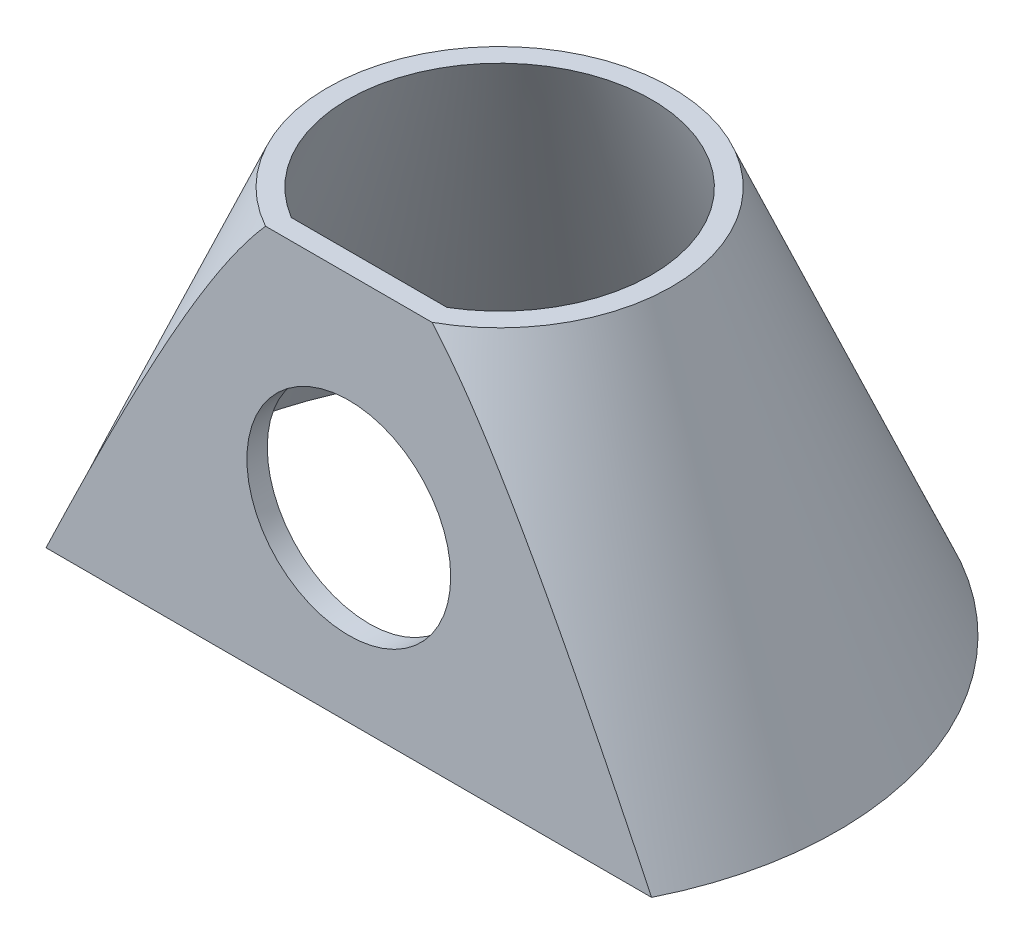
ISO-10303-21;
HEADER;
FILE_DESCRIPTION(('STEP AP214'),'2;1');
FILE_NAME('part.step','',(''),(''),'','','');
FILE_SCHEMA(('AUTOMOTIVE_DESIGN { 1 0 10303 214 1 1 1 1 }'));
ENDSEC;
DATA;
#1=APPLICATION_CONTEXT('core data for automotive mechanical design processes');
#2=APPLICATION_PROTOCOL_DEFINITION('international standard','automotive_design',2000,#1);
#3=PRODUCT_CONTEXT('',#1,'mechanical');
#4=PRODUCT('Part','Part','',(#3));
#5=PRODUCT_RELATED_PRODUCT_CATEGORY('part','',(#4));
#6=PRODUCT_DEFINITION_FORMATION('','',#4);
#7=PRODUCT_DEFINITION_CONTEXT('part definition',#1,'design');
#8=PRODUCT_DEFINITION('design','',#6,#7);
#9=PRODUCT_DEFINITION_SHAPE('','',#8);
#10=(LENGTH_UNIT() NAMED_UNIT(*) SI_UNIT(.MILLI.,.METRE.));
#11=(NAMED_UNIT(*) PLANE_ANGLE_UNIT() SI_UNIT($,.RADIAN.));
#12=(NAMED_UNIT(*) SI_UNIT($,.STERADIAN.) SOLID_ANGLE_UNIT());
#13=UNCERTAINTY_MEASURE_WITH_UNIT(LENGTH_MEASURE(1.E-05),#10,'distance_accuracy_value','');
#14=(GEOMETRIC_REPRESENTATION_CONTEXT(3) GLOBAL_UNCERTAINTY_ASSIGNED_CONTEXT((#13)) GLOBAL_UNIT_ASSIGNED_CONTEXT((#10,
#11,#12)) REPRESENTATION_CONTEXT('',''));
#15=CARTESIAN_POINT('',(0.,0.,0.));
#16=DIRECTION('',(0.,0.,1.));
#17=DIRECTION('',(1.,0.,0.));
#18=AXIS2_PLACEMENT_3D('',#15,#16,#17);
#19=CARTESIAN_POINT('',(-21.6651654977236,-2.68328734594304,7.4));
#20=DIRECTION('',(0.,0.,-1.));
#21=DIRECTION('',(-1.,0.,0.));
#22=AXIS2_PLACEMENT_3D('',#19,#20,#21);
#23=PLANE('',#22);
#24=CARTESIAN_POINT('',(0.,7.01671265405697,7.4));
#25=DIRECTION('',(0.,0.,1.));
#26=DIRECTION('',(1.,0.,0.));
#27=AXIS2_PLACEMENT_3D('',#24,#25,#26);
#28=CIRCLE('',#27,5.);
#29=CARTESIAN_POINT('',(5.,7.01671265405697,7.4));
#30=VERTEX_POINT('',#29);
#31=EDGE_CURVE('E81',#30,#30,#28,.T.);
#32=ORIENTED_EDGE('',*,*,#31,.F.);
#33=EDGE_LOOP('',(#32));
#34=FACE_BOUND('',#33,.T.);
#35=CARTESIAN_POINT('',(-25.5153695014383,-25.000462947489,7.4));
#36=CARTESIAN_POINT('',(-25.1987811037342,-24.2893071531394,7.4));
#37=CARTESIAN_POINT('',(-24.8818148083435,-23.5783196268933,7.4));
#38=CARTESIAN_POINT('',(-24.2470273094439,-22.1567257916633,7.4));
#39=CARTESIAN_POINT('',(-23.929206105383,-21.446119482926,7.4));
#40=CARTESIAN_POINT('',(-22.9742887787246,-19.3148887886707,7.4));
#41=CARTESIAN_POINT('',(-22.3357620983142,-17.8949046912977,7.4));
#42=CARTESIAN_POINT('',(-21.0528616653301,-15.0550035630363,7.4));
#43=CARTESIAN_POINT('',(-20.4084805544433,-13.6350898546372,7.4));
#44=CARTESIAN_POINT('',(-19.1133242946361,-10.7982249529963,7.4));
#45=CARTESIAN_POINT('',(-18.4625493274255,-9.38127367694376,7.4));
#46=CARTESIAN_POINT('',(-17.4666150236184,-7.2302541840945,7.4));
#47=CARTESIAN_POINT('',(-17.1246278702415,-6.49471725146057,7.4));
#48=CARTESIAN_POINT('',(-16.4378440024824,-5.02495626130916,7.4));
#49=CARTESIAN_POINT('',(-16.0930472910668,-4.29073220240642,7.4));
#50=CARTESIAN_POINT('',(-15.4000540673009,-2.82380660208974,7.4));
#51=CARTESIAN_POINT('',(-15.0518572455827,-2.09110520671575,7.4));
#52=CARTESIAN_POINT('',(-14.3513670311147,-0.627665151721085,7.4));
#53=CARTESIAN_POINT('',(-13.9990736551598,0.103073515931128,7.4));
#54=CARTESIAN_POINT('',(-13.2896866855573,1.56156015933721,7.4));
#55=CARTESIAN_POINT('',(-12.9325967899877,2.28930993112212,7.4));
#56=CARTESIAN_POINT('',(-12.2120648568836,3.7416539887777,7.4));
#57=CARTESIAN_POINT('',(-11.8486228755754,4.46624830250847,7.4));
#58=CARTESIAN_POINT('',(-11.1136355886296,5.91119902042788,7.4));
#59=CARTESIAN_POINT('',(-10.7420914707322,6.63155602638915,7.4));
#60=CARTESIAN_POINT('',(-10.1766795809354,7.70782143855152,7.4));
#61=CARTESIAN_POINT('',(-9.98686300524666,8.06585876194232,7.4));
#62=CARTESIAN_POINT('',(-9.60407031130492,8.78023917701544,7.4));
#63=CARTESIAN_POINT('',(-9.4110942225603,9.13658228448092,7.4));
#64=CARTESIAN_POINT('',(-9.07200380756849,9.75499765640086,7.4));
#65=CARTESIAN_POINT('',(-8.92672816132625,10.0175297408098,7.4));
#66=CARTESIAN_POINT('',(-8.63386131671555,10.5413037248503,7.4));
#67=CARTESIAN_POINT('',(-8.48627009726228,10.8025456127053,7.4));
#68=CARTESIAN_POINT('',(-8.18841403061081,11.3235709855227,7.4));
#69=CARTESIAN_POINT('',(-8.03814865994441,11.5833541715537,7.4));
#70=CARTESIAN_POINT('',(-7.7345722040517,12.101135226453,7.4));
#71=CARTESIAN_POINT('',(-7.58126113727745,12.3591331061247,7.4));
#72=CARTESIAN_POINT('',(-7.27203017464863,12.8714560315719,7.4));
#73=CARTESIAN_POINT('',(-7.11613143015534,13.1257938237222,7.4));
#74=CARTESIAN_POINT('',(-6.8002410854048,13.6319135263038,7.4));
#75=CARTESIAN_POINT('',(-6.64024956738023,13.8836954879454,7.4));
#76=CARTESIAN_POINT('',(-6.31546091276421,14.3840499155108,7.4));
#77=CARTESIAN_POINT('',(-6.15066509759186,14.6326232373306,7.4));
#78=CARTESIAN_POINT('',(-5.81527740997833,15.1258202700154,7.4));
#79=CARTESIAN_POINT('',(-5.6446859718727,15.370444274832,7.4));
#80=CARTESIAN_POINT('',(-5.35211707780906,15.7772190972783,7.4));
#81=CARTESIAN_POINT('',(-5.23203494578663,15.9407323419574,7.4));
#82=CARTESIAN_POINT('',(-4.98809754968169,16.2649348846004,7.4));
#83=CARTESIAN_POINT('',(-4.864242178147,16.4256241019374,7.4));
#84=CARTESIAN_POINT('',(-4.61135157562501,16.7445722481355,7.4));
#85=CARTESIAN_POINT('',(-4.48228817654204,16.9028089286337,7.4));
#86=CARTESIAN_POINT('',(-4.21899273402062,17.2149167377436,7.4));
#87=CARTESIAN_POINT('',(-4.08476099185169,17.3687881199089,7.4));
#88=CARTESIAN_POINT('',(-3.77000524436053,17.7152992189218,7.4));
#89=CARTESIAN_POINT('',(-3.58743418131528,17.9060996082301,7.4));
#90=CARTESIAN_POINT('',(-3.20940982849892,18.2751115070146,7.4));
#91=CARTESIAN_POINT('',(-3.01394189315001,18.4533082111775,7.4));
#92=CARTESIAN_POINT('',(-2.60911912145004,18.7895081763233,7.4));
#93=CARTESIAN_POINT('',(-2.39990831517277,18.9476818694126,7.4));
#94=CARTESIAN_POINT('',(-1.96349144643493,19.2362822498365,7.4));
#95=CARTESIAN_POINT('',(-1.73634393560305,19.3667944807789,7.4));
#96=CARTESIAN_POINT('',(-1.31931934185474,19.5604091492509,7.4));
#97=CARTESIAN_POINT('',(-1.13358710904017,19.6321728337094,7.4));
#98=CARTESIAN_POINT('',(-0.84827077298865,19.716576839401,7.4));
#99=CARTESIAN_POINT('',(-0.752079495155067,19.7408336212453,7.4));
#100=CARTESIAN_POINT('',(-0.557964048672394,19.7808581352778,7.4));
#101=CARTESIAN_POINT('',(-0.460040691971082,19.7966297415572,7.4));
#102=CARTESIAN_POINT('',(-0.262383512525687,19.8191927977787,7.4));
#103=CARTESIAN_POINT('',(-0.162641529332432,19.8259133575662,7.4));
#104=CARTESIAN_POINT('',(0.0370299116707364,19.8298763395142,7.4));
#105=CARTESIAN_POINT('',(0.136959363966638,19.8271190362095,7.4));
#106=CARTESIAN_POINT('',(0.33620808988853,19.8122310994343,7.4));
#107=CARTESIAN_POINT('',(0.435526682499181,19.8000914333471,7.4));
#108=CARTESIAN_POINT('',(0.632697942638883,19.76689606216,7.4));
#109=CARTESIAN_POINT('',(0.730549787076518,19.7458355316196,7.4));
#110=CARTESIAN_POINT('',(0.942168255734871,19.690840544496,7.4));
#111=CARTESIAN_POINT('',(1.0555010227537,19.6552380099459,7.4));
#112=CARTESIAN_POINT('',(1.27853747133302,19.573981034691,7.4));
#113=CARTESIAN_POINT('',(1.38823831529984,19.5283189382122,7.4));
#114=CARTESIAN_POINT('',(1.71155538922704,19.3784855818422,7.4));
#115=CARTESIAN_POINT('',(1.91925906533793,19.261503386381,7.4));
#116=CARTESIAN_POINT('',(2.30678762215349,19.0119988521395,7.4));
#117=CARTESIAN_POINT('',(2.48754045874516,18.8808622929111,7.4));
#118=CARTESIAN_POINT('',(2.83747496452985,18.6037665507101,7.4));
#119=CARTESIAN_POINT('',(3.00664485665036,18.4577926455609,7.4));
#120=CARTESIAN_POINT('',(3.33572154282709,18.1546490431251,7.4));
#121=CARTESIAN_POINT('',(3.49559034690424,17.9974385778594,7.4));
#122=CARTESIAN_POINT('',(3.72913577849239,17.7557243785847,7.4));
#123=CARTESIAN_POINT('',(3.80592461677428,17.6741890211026,7.4));
#124=CARTESIAN_POINT('',(3.95761388666103,17.5093813563851,7.4));
#125=CARTESIAN_POINT('',(4.03251434757923,17.4261090761488,7.4));
#126=CARTESIAN_POINT('',(4.26336771999647,17.1641200543473,7.4));
#127=CARTESIAN_POINT('',(4.4163315447521,16.9827655606578,7.4));
#128=CARTESIAN_POINT('',(4.71588532040102,16.6148483126393,7.4));
#129=CARTESIAN_POINT('',(4.86247404000197,16.428284563516,7.4));
#130=CARTESIAN_POINT('',(5.15038031622078,16.0509576597229,7.4));
#131=CARTESIAN_POINT('',(5.2916944855643,15.860191927473,7.4));
#132=CARTESIAN_POINT('',(5.56977797168454,15.4753695858587,7.4));
#133=CARTESIAN_POINT('',(5.70654698965232,15.2813127613918,7.4));
#134=CARTESIAN_POINT('',(6.11173978905375,14.6941569541804,7.4));
#135=CARTESIAN_POINT('',(6.37432984124959,14.2970316992211,7.4));
#136=CARTESIAN_POINT('',(6.88779191437563,13.4955425877533,7.4));
#137=CARTESIAN_POINT('',(7.13866797005473,13.0911812909939,7.4));
#138=CARTESIAN_POINT('',(7.63337467131147,12.2738378998749,7.4));
#139=CARTESIAN_POINT('',(7.87713443347728,11.8608130257873,7.4));
#140=CARTESIAN_POINT('',(8.35746662049717,11.0305755664858,7.4));
#141=CARTESIAN_POINT('',(8.59403846506914,10.6133626467682,7.4));
#142=CARTESIAN_POINT('',(9.0609828447831,9.77639780188603,7.4));
#143=CARTESIAN_POINT('',(9.29136503044715,9.35665124952832,7.4));
#144=CARTESIAN_POINT('',(9.74736665844167,8.51460122194194,7.4));
#145=CARTESIAN_POINT('',(9.97298624989237,8.09229782730418,7.4));
#146=CARTESIAN_POINT('',(10.5565511906065,6.98766950116412,7.4));
#147=CARTESIAN_POINT('',(10.9113632931018,6.30369004651654,7.4));
#148=CARTESIAN_POINT('',(11.6132204051722,4.93175146457537,7.4));
#149=CARTESIAN_POINT('',(11.9602652328233,4.24379224454229,7.4));
#150=CARTESIAN_POINT('',(12.6482832338542,2.86477763806435,7.4));
#151=CARTESIAN_POINT('',(12.9892559046088,2.17372200118378,7.4));
#152=CARTESIAN_POINT('',(13.6663230311545,0.789224335086069,7.4));
#153=CARTESIAN_POINT('',(14.0024174630704,0.0957822942098692,7.4));
#154=CARTESIAN_POINT('',(14.6709887222443,-1.29374658350962,7.4));
#155=CARTESIAN_POINT('',(15.0034613400879,-1.98983544390288,7.4));
#156=CARTESIAN_POINT('',(15.6651149210795,-3.38357599338923,7.4));
#157=CARTESIAN_POINT('',(15.9942958780907,-4.08122768539302,7.4));
#158=CARTESIAN_POINT('',(16.9777049566414,-6.17603760588324,7.4));
#159=CARTESIAN_POINT('',(17.627832800485,-7.57512064109295,7.4));
#160=CARTESIAN_POINT('',(18.8882873128458,-10.3076810608352,7.4));
#161=CARTESIAN_POINT('',(19.4989932242326,-11.6409839414348,7.4));
#162=CARTESIAN_POINT('',(20.7150014241409,-14.3100744792635,7.4));
#163=CARTESIAN_POINT('',(21.3203036313381,-15.645862173524,7.4));
#164=CARTESIAN_POINT('',(22.5257953764116,-18.3172877821433,7.4));
#165=CARTESIAN_POINT('',(23.1259913063834,-19.6529228147923,7.4));
#166=CARTESIAN_POINT('',(24.3230060886259,-22.3256712405314,7.4));
#167=CARTESIAN_POINT('',(24.9198250132516,-23.6627846012078,7.4));
#168=CARTESIAN_POINT('',(25.5153695014383,-25.000462947489,7.4));
#169=B_SPLINE_CURVE_WITH_KNOTS('',3,(#35,#36,#37,#38,#39,#40,#41,#42,#43,#44,#45,#46,#47,#48,
#49,#50,#51,#52,#53,#54,#55,#56,#57,#58,#59,#60,#61,#62,#63,#64,#65,#66,#67,#68,#69,#70,#71,#72,
#73,#74,#75,#76,#77,#78,#79,#80,#81,#82,#83,#84,#85,#86,#87,#88,#89,#90,#91,#92,#93,#94,#95,#96,
#97,#98,#99,#100,#101,#102,#103,#104,#105,#106,#107,#108,#109,#110,#111,#112,#113,#114,#115,
#116,#117,#118,#119,#120,#121,#122,#123,#124,#125,#126,#127,#128,#129,#130,#131,#132,#133,#134,
#135,#136,#137,#138,#139,#140,#141,#142,#143,#144,#145,#146,#147,#148,#149,#150,#151,#152,#153,
#154,#155,#156,#157,#158,#159,#160,#161,#162,#163,#164,#165,#166,#167,#168),.UNSPECIFIED.,.F.,
.F.,(4,2,2,2,2,2,2,2,2,2,2,2,2,2,2,2,2,2,2,2,2,2,2,2,2,2,2,2,2,2,2,2,2,2,2,2,2,2,2,2,2,2,2,2,2,
2,2,2,2,2,2,2,2,2,2,2,2,2,2,2,2,2,2,2,2,2,4),(0.,2.33532349492738,4.67064849824989,
9.34146942750626,14.01932559381,18.6970492002941,21.1305046948569,23.5639576202952,
25.9976340620736,28.4313005299758,30.8631875907655,33.2950531362747,35.7265645454318,
36.9422783640562,38.1579808349299,39.0581116083334,39.9582505827829,40.8585677420994,
41.7588794485961,42.6537934974414,43.548689579626,44.4433418012256,45.3379271230623,
45.9464929679557,46.5550761594735,47.1675695532552,47.7800272978811,48.5718009689905,
49.3644897843109,50.1498982795586,50.9328412515125,51.5278118517972,51.8250951488118,
52.122242599242,52.4217041084934,52.7211569436438,53.0208984285973,53.3208022560561,
53.6766156481583,54.0327007713146,54.7452624903583,55.4142972526496,56.0840024598825,
56.756274590029,57.0922585629002,57.4282373170634,58.1397852741035,58.8514700551695,
59.5636042751494,60.2757852202605,61.7037410206799,63.1312012944106,64.5698823756948,
66.0086792950631,67.4450847375364,68.8814451382208,71.1929683444957,73.5045456343594,
75.816313384759,78.1280924456404,80.4423204534196,82.7565527749262,87.3847846988426,
91.7843082666946,96.1838979348645,100.57677421332,104.969556011826),.UNSPECIFIED.);
#170=CARTESIAN_POINT('',(-14.8564878815043,-1.68328734594303,7.4));
#171=VERTEX_POINT('',#170);
#172=CARTESIAN_POINT('',(-4.08480840759123,17.366712654057,7.4));
#173=VERTEX_POINT('',#172);
#174=EDGE_CURVE('E86',#171,#173,#169,.T.);
#175=ORIENTED_EDGE('',*,*,#174,.F.);
#176=DIRECTION('',(1.,0.,0.));
#177=VECTOR('',#176,1.);
#178=CARTESIAN_POINT('',(-21.6651654977236,-1.68328734594303,7.4));
#179=LINE('',#178,#177);
#180=CARTESIAN_POINT('',(14.8564878815043,-1.68328734594302,7.4));
#181=VERTEX_POINT('',#180);
#182=EDGE_CURVE('E48',#171,#181,#179,.T.);
#183=ORIENTED_EDGE('',*,*,#182,.T.);
#184=CARTESIAN_POINT('',(4.08480840759122,17.366712654057,7.4));
#185=VERTEX_POINT('',#184);
#186=EDGE_CURVE('E88',#185,#181,#169,.T.);
#187=ORIENTED_EDGE('',*,*,#186,.F.);
#188=DIRECTION('',(1.,0.,0.));
#189=VECTOR('',#188,1.);
#190=CARTESIAN_POINT('',(-21.6651654977236,17.366712654057,7.4));
#191=LINE('',#190,#189);
#192=EDGE_CURVE('E125',#173,#185,#191,.T.);
#193=ORIENTED_EDGE('',*,*,#192,.F.);
#194=EDGE_LOOP('',(#175,#183,#187,#193));
#195=FACE_BOUND('',#194,.T.);
#196=ADVANCED_FACE('F33',(#34,#195),#23,.F.);
#197=CARTESIAN_POINT('',(0.,-2.68328734594303,0.));
#198=DIRECTION('',(0.,-1.,0.));
#199=DIRECTION('',(1.,0.,0.));
#200=AXIS2_PLACEMENT_3D('',#197,#198,#199);
#201=CONICAL_SURFACE('',#200,16.025,0.404031448097582);
#202=CARTESIAN_POINT('',(0.,-1.68328734594303,0.));
#203=DIRECTION('',(0.,1.,0.));
#204=DIRECTION('',(-1.,0.,0.));
#205=AXIS2_PLACEMENT_3D('',#202,#203,#204);
#206=CIRCLE('',#205,15.5974465558195);
#207=CARTESIAN_POINT('',(14.2239354280609,-1.68328734594303,6.4));
#208=VERTEX_POINT('',#207);
#209=CARTESIAN_POINT('',(-14.2239354280609,-1.68328734594303,6.4));
#210=VERTEX_POINT('',#209);
#211=EDGE_CURVE('E54',#208,#210,#206,.T.);
#212=ORIENTED_EDGE('',*,*,#211,.F.);
#213=CARTESIAN_POINT('',(-24.752787928015,-25.000462947489,6.4));
#214=CARTESIAN_POINT('',(-24.1376674300955,-23.6076822944941,6.4));
#215=CARTESIAN_POINT('',(-23.5214232224433,-22.2153958943165,6.4));
#216=CARTESIAN_POINT('',(-22.2858781751615,-19.4321466039131,6.4));
#217=CARTESIAN_POINT('',(-21.666577273867,-18.0411837410688,6.4));
#218=CARTESIAN_POINT('',(-20.4236199804767,-15.2598216848333,6.4));
#219=CARTESIAN_POINT('',(-19.7999604059139,-13.8694239123881,6.4));
#220=CARTESIAN_POINT('',(-18.5475791991294,-11.0909331872348,6.4));
#221=CARTESIAN_POINT('',(-17.918857641104,-9.70284020110277,6.4));
#222=CARTESIAN_POINT('',(-16.6492931364243,-6.91815045025289,6.4));
#223=CARTESIAN_POINT('',(-16.008392774783,-5.52157980290083,6.4));
#224=CARTESIAN_POINT('',(-15.0396641238262,-3.43010096490789,6.4));
#225=CARTESIAN_POINT('',(-14.7155171679009,-2.7334878416205,6.4));
#226=CARTESIAN_POINT('',(-14.0642375246727,-1.34165916025791,6.4));
#227=CARTESIAN_POINT('',(-13.7371048432098,-0.646443599452429,6.4));
#228=CARTESIAN_POINT('',(-13.0793160326952,0.741992917973693,6.4));
#229=CARTESIAN_POINT('',(-12.7486613063457,1.43521453857369,6.4));
#230=CARTESIAN_POINT('',(-12.0828145703276,2.81947459951559,6.4));
#231=CARTESIAN_POINT('',(-11.7476225818018,3.51051305001211,6.4));
#232=CARTESIAN_POINT('',(-11.0715035425767,4.88971858797472,6.4));
#233=CARTESIAN_POINT('',(-10.7305769171318,5.57788588367044,6.4));
#234=CARTESIAN_POINT('',(-10.0412627120056,6.95046839512704,6.4));
#235=CARTESIAN_POINT('',(-9.69287531410196,7.634883701794,6.4));
#236=CARTESIAN_POINT('',(-9.20976667313733,8.56694993745888,6.4));
#237=CARTESIAN_POINT('',(-9.07938174332165,8.81685016701613,6.4));
#238=CARTESIAN_POINT('',(-8.81708217795924,9.31584826243521,6.4));
#239=CARTESIAN_POINT('',(-8.68516753672518,9.56494612530952,6.4));
#240=CARTESIAN_POINT('',(-8.41960372959333,10.0622452230132,6.4));
#241=CARTESIAN_POINT('',(-8.2859544112441,10.3104463765514,6.4));
#242=CARTESIAN_POINT('',(-8.01669269444047,10.8057792228435,6.4));
#243=CARTESIAN_POINT('',(-7.88108029844368,11.0529109169356,6.4));
#244=CARTESIAN_POINT('',(-7.47096146748493,11.7923519446575,6.4));
#245=CARTESIAN_POINT('',(-7.19311116504842,12.2828243505188,6.4));
#246=CARTESIAN_POINT('',(-6.7673938754564,13.0132714839257,6.4));
#247=CARTESIAN_POINT('',(-6.62400820615309,13.2558600708992,6.4));
#248=CARTESIAN_POINT('',(-6.33370380983073,13.7389131491032,6.4));
#249=CARTESIAN_POINT('',(-6.18678513470014,13.9793776714586,6.4));
#250=CARTESIAN_POINT('',(-5.83455426096942,14.5447195321291,6.4));
#251=CARTESIAN_POINT('',(-5.62744320715323,14.86848074722,6.4));
#252=CARTESIAN_POINT('',(-5.20312315336072,15.5095642021053,6.4));
#253=CARTESIAN_POINT('',(-4.9859102700733,15.826883897202,6.4));
#254=CARTESIAN_POINT('',(-4.64987055779923,16.2960321596427,6.4));
#255=CARTESIAN_POINT('',(-4.53603120010951,16.4514331305181,6.4));
#256=CARTESIAN_POINT('',(-4.30443029551305,16.7592779377276,6.4));
#257=CARTESIAN_POINT('',(-4.18666903159943,16.9117219861737,6.4));
#258=CARTESIAN_POINT('',(-3.94660999647995,17.21283952217,6.4));
#259=CARTESIAN_POINT('',(-3.82431537600307,17.3615155118978,6.4));
#260=CARTESIAN_POINT('',(-3.57426852609201,17.6541854696772,6.4));
#261=CARTESIAN_POINT('',(-3.44651723697525,17.7981802369462,6.4));
#262=CARTESIAN_POINT('',(-3.18288912196539,18.0818101179279,6.4));
#263=CARTESIAN_POINT('',(-3.04693324418341,18.2213722706667,6.4));
#264=CARTESIAN_POINT('',(-2.76699652726449,18.4921427769989,6.4));
#265=CARTESIAN_POINT('',(-2.62301977085564,18.6233553090913,6.4));
#266=CARTESIAN_POINT('',(-2.32613287781997,18.8737462488236,6.4));
#267=CARTESIAN_POINT('',(-2.17327359368578,18.9929842026321,6.4));
#268=CARTESIAN_POINT('',(-1.85645957469764,19.2154792602734,6.4));
#269=CARTESIAN_POINT('',(-1.69252317964515,19.3187618917264,6.4));
#270=CARTESIAN_POINT('',(-1.36893797876185,19.4939036941998,6.4));
#271=CARTESIAN_POINT('',(-1.21043896156308,19.5678486376482,6.4));
#272=CARTESIAN_POINT('',(-0.883965674574246,19.691069029668,6.4));
#273=CARTESIAN_POINT('',(-0.716005117866358,19.7403792085559,6.4));
#274=CARTESIAN_POINT('',(-0.458637236222178,19.7914944808881,6.4));
#275=CARTESIAN_POINT('',(-0.371426813394371,19.8047334352875,6.4));
#276=CARTESIAN_POINT('',(-0.196122324613953,19.8228883627567,6.4));
#277=CARTESIAN_POINT('',(-0.108028294755156,19.8278046744106,6.4));
#278=CARTESIAN_POINT('',(0.0682385412152896,19.8290870973611,6.4));
#279=CARTESIAN_POINT('',(0.156411358917603,19.8254516207545,6.4));
#280=CARTESIAN_POINT('',(0.331987624787959,19.8097996189416,6.4));
#281=CARTESIAN_POINT('',(0.4193910767611,19.7977831352094,6.4));
#282=CARTESIAN_POINT('',(0.659858891399239,19.7534250333097,6.4));
#283=CARTESIAN_POINT('',(0.811394808721849,19.7125508286529,6.4));
#284=CARTESIAN_POINT('',(1.10706181510539,19.6100943469161,6.4));
#285=CARTESIAN_POINT('',(1.25119101716806,19.5485068225895,6.4));
#286=CARTESIAN_POINT('',(1.52289112865772,19.4135175254125,6.4));
#287=CARTESIAN_POINT('',(1.65093643299852,19.3410521684739,6.4));
#288=CARTESIAN_POINT('',(1.9002435616076,19.1851748708567,6.4));
#289=CARTESIAN_POINT('',(2.02149936708592,19.1017534302354,6.4));
#290=CARTESIAN_POINT('',(2.25823442236349,18.9261941216524,6.4));
#291=CARTESIAN_POINT('',(2.37368790274952,18.8340218626404,6.4));
#292=CARTESIAN_POINT('',(2.59897923473334,18.6432046492859,6.4));
#293=CARTESIAN_POINT('',(2.70881964732598,18.5445626945478,6.4));
#294=CARTESIAN_POINT('',(2.9279782155469,18.338110159144,6.4));
#295=CARTESIAN_POINT('',(3.03709829993668,18.2300904662042,6.4));
#296=CARTESIAN_POINT('',(3.25083302542972,18.0096686137866,6.4));
#297=CARTESIAN_POINT('',(3.35544680175261,17.8972656209503,6.4));
#298=CARTESIAN_POINT('',(3.6636342897413,17.5546442108133,6.4));
#299=CARTESIAN_POINT('',(3.86137844843481,17.3191838794618,6.4));
#300=CARTESIAN_POINT('',(4.24568758716596,16.8382202143719,6.4));
#301=CARTESIAN_POINT('',(4.43221472777096,16.5926871259108,6.4));
#302=CARTESIAN_POINT('',(4.79613237584372,16.0949057838362,6.4));
#303=CARTESIAN_POINT('',(4.97352126835414,15.8426563551437,6.4));
#304=CARTESIAN_POINT('',(5.32253218042012,15.3310601544831,6.4));
#305=CARTESIAN_POINT('',(5.4940919283691,15.0716711411572,6.4));
#306=CARTESIAN_POINT('',(5.8312931903257,14.5490516178378,6.4));
#307=CARTESIAN_POINT('',(5.99693412488996,14.2858207352644,6.4));
#308=CARTESIAN_POINT('',(6.32299280612429,13.7569620191649,6.4));
#309=CARTESIAN_POINT('',(6.48342137724193,13.491340840222,6.4));
#310=CARTESIAN_POINT('',(6.80025052597734,12.9577281908319,6.4));
#311=CARTESIAN_POINT('',(6.95665128507649,12.6897368279116,6.4));
#312=CARTESIAN_POINT('',(7.26287852189714,12.1573573894778,6.4));
#313=CARTESIAN_POINT('',(7.41277406235473,11.8930089729567,6.4));
#314=CARTESIAN_POINT('',(7.70979099029423,11.3627569609967,6.4));
#315=CARTESIAN_POINT('',(7.85691234827062,11.0968533490564,6.4));
#316=CARTESIAN_POINT('',(8.29472144969875,10.2971636892254,6.4));
#317=CARTESIAN_POINT('',(8.58184028796129,9.76142322190263,6.4));
#318=CARTESIAN_POINT('',(9.14890760149543,8.68603415467023,6.4));
#319=CARTESIAN_POINT('',(9.42885455927005,8.14638475815436,6.4));
#320=CARTESIAN_POINT('',(9.98308768886019,7.06418274997572,6.4));
#321=CARTESIAN_POINT('',(10.2573737913934,6.52163010288275,6.4));
#322=CARTESIAN_POINT('',(10.8018061599185,5.43349602301871,6.4));
#323=CARTESIAN_POINT('',(11.0719460228703,4.88791139204729,6.4));
#324=CARTESIAN_POINT('',(11.6085369737266,3.79492939198311,6.4));
#325=CARTESIAN_POINT('',(11.8749880413402,3.24753201293952,6.4));
#326=CARTESIAN_POINT('',(12.4048111283519,2.15133704305884,6.4));
#327=CARTESIAN_POINT('',(12.6681835381613,1.60253964075439,6.4));
#328=CARTESIAN_POINT('',(13.1923797940758,0.503728442385594,6.4));
#329=CARTESIAN_POINT('',(13.45320363419,-0.0462853565344575,6.4));
#330=CARTESIAN_POINT('',(14.2290634121485,-1.69063861201825,6.4));
#331=CARTESIAN_POINT('',(14.740942559255,-2.78646756106387,6.4));
#332=CARTESIAN_POINT('',(15.758506562416,-4.98103118071273,6.4));
#333=CARTESIAN_POINT('',(16.2641912320438,-6.07976593756395,6.4));
#334=CARTESIAN_POINT('',(17.2705520321299,-8.27879335200186,6.4));
#335=CARTESIAN_POINT('',(17.7712307680501,-9.37908481805407,6.4));
#336=CARTESIAN_POINT('',(18.7689080888996,-11.581335064331,6.4));
#337=CARTESIAN_POINT('',(19.2659066698812,-12.6832938463428,6.4));
#338=CARTESIAN_POINT('',(20.1801401126012,-14.7175637321236,6.4));
#339=CARTESIAN_POINT('',(20.5977940461119,-15.6496866090441,6.4));
#340=CARTESIAN_POINT('',(21.4314027840279,-17.5148263737667,6.4));
#341=CARTESIAN_POINT('',(21.8473573777038,-18.4478433557327,6.4));
#342=CARTESIAN_POINT('',(22.6789774144022,-20.3171960962841,6.4));
#343=CARTESIAN_POINT('',(23.094638645541,-21.25353372802,6.4));
#344=CARTESIAN_POINT('',(23.9246390633127,-23.1266573929775,6.4));
#345=CARTESIAN_POINT('',(24.3389784058803,-24.0634433570958,6.4));
#346=CARTESIAN_POINT('',(24.752787928015,-25.000462947489,6.4));
#347=B_SPLINE_CURVE_WITH_KNOTS('',3,(#213,#214,#215,#216,#217,#218,#219,#220,#221,#222,#223,
#224,#225,#226,#227,#228,#229,#230,#231,#232,#233,#234,#235,#236,#237,#238,#239,#240,#241,#242,
#243,#244,#245,#246,#247,#248,#249,#250,#251,#252,#253,#254,#255,#256,#257,#258,#259,#260,#261,
#262,#263,#264,#265,#266,#267,#268,#269,#270,#271,#272,#273,#274,#275,#276,#277,#278,#279,#280,
#281,#282,#283,#284,#285,#286,#287,#288,#289,#290,#291,#292,#293,#294,#295,#296,#297,#298,#299,
#300,#301,#302,#303,#304,#305,#306,#307,#308,#309,#310,#311,#312,#313,#314,#315,#316,#317,#318,
#319,#320,#321,#322,#323,#324,#325,#326,#327,#328,#329,#330,#331,#332,#333,#334,#335,#336,#337,
#338,#339,#340,#341,#342,#343,#344,#345,#346),.UNSPECIFIED.,.F.,.F.,(4,2,2,2,2,2,2,2,2,2,2,2,2,
2,2,2,2,2,2,2,2,2,2,2,2,2,2,2,2,2,2,2,2,2,2,2,2,2,2,2,2,2,2,2,2,2,2,2,2,2,2,2,2,2,2,2,2,2,2,2,2,
2,2,2,2,2,4),(0.,4.56770414502221,9.13550081731013,13.707080590227,18.2785934766441,
22.8883849707642,25.1933892904591,27.4983891026966,29.8025029031674,32.1066059706368,
34.4105389231241,36.7144158052303,37.5600197685082,38.4056268766607,39.2513088107529,
40.096989686202,41.7879535896187,42.6333166269937,43.4786672562867,44.6315557007518,
45.7848910584036,46.3627521401249,46.9405716150645,47.5179967640309,48.0953228068329,
48.6795701040148,49.2635226819667,49.8444104097197,50.424358903257,50.9475656937793,
51.4700327662419,51.7343187696676,51.998594021081,52.2629183472168,52.5272413653325,
52.9961074240294,53.4650923488114,53.9057955585116,54.34688345336,54.789782884661,
55.2324784025072,55.692949917757,56.1535094093835,57.0753611902856,58.0001659457354,
58.925133580589,59.8580094019129,60.7909763016184,61.7218625906067,62.6527068629512,
63.5643554979179,64.4760138234883,66.2994147659343,68.1231983871967,69.947004316235,
71.7733894424845,73.5997846110945,75.4259456016036,77.2521108839134,80.8805445721683,
84.5090871933787,88.1356310718882,91.762178840014,94.8264207555136,97.8910317757547,
100.964387545859,104.037366271564),.UNSPECIFIED.);
#348=CARTESIAN_POINT('',(3.8184490095282,17.366712654057,6.4));
#349=VERTEX_POINT('',#348);
#350=EDGE_CURVE('E78',#349,#208,#347,.T.);
#351=ORIENTED_EDGE('',*,*,#350,.F.);
#352=CARTESIAN_POINT('',(0.,17.366712654057,0.));
#353=DIRECTION('',(0.,1.,0.));
#354=DIRECTION('',(-1.,0.,0.));
#355=AXIS2_PLACEMENT_3D('',#352,#353,#354);
#356=CIRCLE('',#355,7.45255344418052);
#357=CARTESIAN_POINT('',(-3.81844900952821,17.366712654057,6.4));
#358=VERTEX_POINT('',#357);
#359=EDGE_CURVE('E128',#349,#358,#356,.T.);
#360=ORIENTED_EDGE('',*,*,#359,.T.);
#361=EDGE_CURVE('E79',#210,#358,#347,.T.);
#362=ORIENTED_EDGE('',*,*,#361,.F.);
#363=EDGE_LOOP('',(#212,#351,#360,#362));
#364=FACE_BOUND('',#363,.T.);
#365=ADVANCED_FACE('F35',(#364),#201,.F.);
#366=CARTESIAN_POINT('',(0.,18.366712654057,0.));
#367=DIRECTION('',(0.,-1.,0.));
#368=DIRECTION('',(1.,0.,0.));
#369=AXIS2_PLACEMENT_3D('',#366,#367,#368);
#370=CONICAL_SURFACE('',#369,8.025,0.404031448097582);
#371=CARTESIAN_POINT('',(0.,-1.68328734594303,0.));
#372=DIRECTION('',(0.,1.,0.));
#373=DIRECTION('',(-1.,0.,0.));
#374=AXIS2_PLACEMENT_3D('',#371,#372,#373);
#375=CIRCLE('',#374,16.5974465558195);
#376=EDGE_CURVE('E80',#171,#181,#375,.F.);
#377=ORIENTED_EDGE('',*,*,#376,.F.);
#378=ORIENTED_EDGE('',*,*,#174,.T.);
#379=CARTESIAN_POINT('',(0.,17.366712654057,0.));
#380=DIRECTION('',(0.,1.,0.));
#381=DIRECTION('',(-1.,0.,0.));
#382=AXIS2_PLACEMENT_3D('',#379,#380,#381);
#383=CIRCLE('',#382,8.45255344418052);
#384=EDGE_CURVE('E127',#173,#185,#383,.F.);
#385=ORIENTED_EDGE('',*,*,#384,.T.);
#386=ORIENTED_EDGE('',*,*,#186,.T.);
#387=EDGE_LOOP('',(#377,#378,#385,#386));
#388=FACE_BOUND('',#387,.T.);
#389=ADVANCED_FACE('F105',(#388),#370,.T.);
#390=CARTESIAN_POINT('',(-15.3326652934185,49.0483439666192,6.4));
#391=DIRECTION('',(0.,0.,-1.));
#392=DIRECTION('',(-1.,0.,0.));
#393=AXIS2_PLACEMENT_3D('',#390,#391,#392);
#394=PLANE('',#393);
#395=CARTESIAN_POINT('',(0.,7.01671265405697,6.4));
#396=DIRECTION('',(0.,0.,-1.));
#397=DIRECTION('',(-1.,0.,0.));
#398=AXIS2_PLACEMENT_3D('',#395,#396,#397);
#399=CIRCLE('',#398,5.);
#400=CARTESIAN_POINT('',(-5.,7.01671265405697,6.4));
#401=VERTEX_POINT('',#400);
#402=EDGE_CURVE('E133',#401,#401,#399,.F.);
#403=ORIENTED_EDGE('',*,*,#402,.T.);
#404=EDGE_LOOP('',(#403));
#405=FACE_BOUND('',#404,.T.);
#406=DIRECTION('',(1.,0.,0.));
#407=VECTOR('',#406,1.);
#408=CARTESIAN_POINT('',(-15.3326652934185,-1.68328734594303,6.4));
#409=LINE('',#408,#407);
#410=EDGE_CURVE('E11',#210,#208,#409,.T.);
#411=ORIENTED_EDGE('',*,*,#410,.F.);
#412=ORIENTED_EDGE('',*,*,#361,.T.);
#413=DIRECTION('',(1.,0.,0.));
#414=VECTOR('',#413,1.);
#415=CARTESIAN_POINT('',(-15.3326652934185,17.366712654057,6.4));
#416=LINE('',#415,#414);
#417=EDGE_CURVE('E42',#358,#349,#416,.T.);
#418=ORIENTED_EDGE('',*,*,#417,.T.);
#419=ORIENTED_EDGE('',*,*,#350,.T.);
#420=EDGE_LOOP('',(#411,#412,#418,#419));
#421=FACE_BOUND('',#420,.T.);
#422=ADVANCED_FACE('F84',(#405,#421),#394,.T.);
#423=CARTESIAN_POINT('',(0.,17.366712654057,0.));
#424=DIRECTION('',(0.,1.,0.));
#425=DIRECTION('',(-1.,0.,0.));
#426=AXIS2_PLACEMENT_3D('',#423,#424,#425);
#427=PLANE('',#426);
#428=ORIENTED_EDGE('',*,*,#417,.F.);
#429=ORIENTED_EDGE('',*,*,#359,.F.);
#430=EDGE_LOOP('',(#428,#429));
#431=FACE_BOUND('',#430,.T.);
#432=ORIENTED_EDGE('',*,*,#192,.T.);
#433=ORIENTED_EDGE('',*,*,#384,.F.);
#434=EDGE_LOOP('',(#432,#433));
#435=FACE_BOUND('',#434,.T.);
#436=ADVANCED_FACE('F104',(#431,#435),#427,.T.);
#437=CARTESIAN_POINT('',(0.,-1.68328734594303,0.));
#438=DIRECTION('',(0.,1.,0.));
#439=DIRECTION('',(-1.,0.,0.));
#440=AXIS2_PLACEMENT_3D('',#437,#438,#439);
#441=PLANE('',#440);
#442=ORIENTED_EDGE('',*,*,#211,.T.);
#443=ORIENTED_EDGE('',*,*,#410,.T.);
#444=EDGE_LOOP('',(#442,#443));
#445=FACE_BOUND('',#444,.T.);
#446=ORIENTED_EDGE('',*,*,#376,.T.);
#447=ORIENTED_EDGE('',*,*,#182,.F.);
#448=EDGE_LOOP('',(#446,#447));
#449=FACE_BOUND('',#448,.T.);
#450=ADVANCED_FACE('F71',(#445,#449),#441,.F.);
#451=CARTESIAN_POINT('',(0.,7.01671265405697,-16.5984465558195));
#452=DIRECTION('',(0.,0.,1.));
#453=DIRECTION('',(1.,0.,0.));
#454=AXIS2_PLACEMENT_3D('',#451,#452,#453);
#455=CYLINDRICAL_SURFACE('',#454,5.);
#456=ORIENTED_EDGE('',*,*,#402,.F.);
#457=EDGE_LOOP('',(#456));
#458=FACE_BOUND('',#457,.T.);
#459=ORIENTED_EDGE('',*,*,#31,.T.);
#460=EDGE_LOOP('',(#459));
#461=FACE_BOUND('',#460,.T.);
#462=ADVANCED_FACE('F139',(#458,#461),#455,.F.);
#463=CLOSED_SHELL('',(#196,#365,#389,#422,#436,#450,#462));
#464=MANIFOLD_SOLID_BREP('B2',#463);
#465=ADVANCED_BREP_SHAPE_REPRESENTATION('',(#18,#464),#14);
#466=SHAPE_DEFINITION_REPRESENTATION(#9,#465);
ENDSEC;
END-ISO-10303-21;
